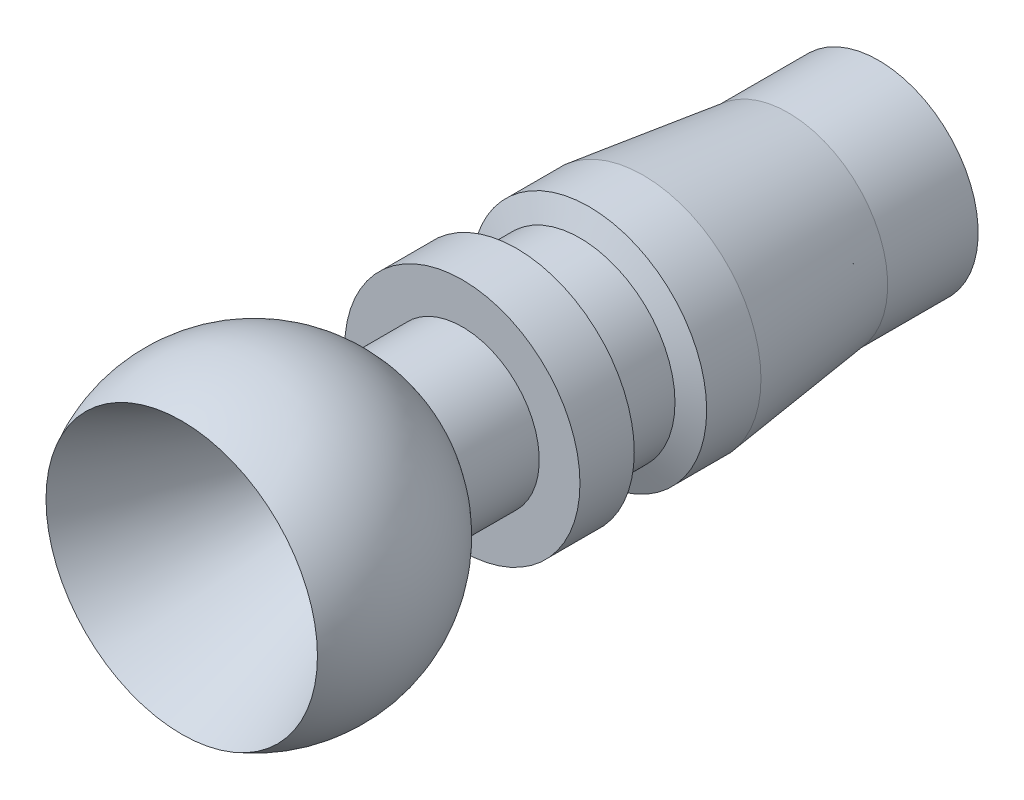
ISO-10303-21;
HEADER;
FILE_DESCRIPTION(('STEP AP214'),'2;1');
FILE_NAME('part.step','',(''),(''),'','','');
FILE_SCHEMA(('AUTOMOTIVE_DESIGN { 1 0 10303 214 1 1 1 1 }'));
ENDSEC;
DATA;
#1=APPLICATION_CONTEXT('core data for automotive mechanical design processes');
#2=APPLICATION_PROTOCOL_DEFINITION('international standard','automotive_design',2000,#1);
#3=PRODUCT_CONTEXT('',#1,'mechanical');
#4=PRODUCT('Part','Part','',(#3));
#5=PRODUCT_RELATED_PRODUCT_CATEGORY('part','',(#4));
#6=PRODUCT_DEFINITION_FORMATION('','',#4);
#7=PRODUCT_DEFINITION_CONTEXT('part definition',#1,'design');
#8=PRODUCT_DEFINITION('design','',#6,#7);
#9=PRODUCT_DEFINITION_SHAPE('','',#8);
#10=(LENGTH_UNIT() NAMED_UNIT(*) SI_UNIT(.MILLI.,.METRE.));
#11=(NAMED_UNIT(*) PLANE_ANGLE_UNIT() SI_UNIT($,.RADIAN.));
#12=(NAMED_UNIT(*) SI_UNIT($,.STERADIAN.) SOLID_ANGLE_UNIT());
#13=UNCERTAINTY_MEASURE_WITH_UNIT(LENGTH_MEASURE(1.E-05),#10,'distance_accuracy_value','');
#14=(GEOMETRIC_REPRESENTATION_CONTEXT(3) GLOBAL_UNCERTAINTY_ASSIGNED_CONTEXT((#13)) GLOBAL_UNIT_ASSIGNED_CONTEXT((#10,
#11,#12)) REPRESENTATION_CONTEXT('',''));
#15=CARTESIAN_POINT('',(0.,0.,0.));
#16=DIRECTION('',(0.,0.,1.));
#17=DIRECTION('',(1.,0.,0.));
#18=AXIS2_PLACEMENT_3D('',#15,#16,#17);
#19=CARTESIAN_POINT('',(0.,0.,-88.99));
#20=DIRECTION('',(0.,0.,-1.));
#21=DIRECTION('',(-1.,0.,0.));
#22=AXIS2_PLACEMENT_3D('',#19,#20,#21);
#23=CYLINDRICAL_SURFACE('',#22,5.5);
#24=CARTESIAN_POINT('',(0.,0.,0.));
#25=DIRECTION('',(0.,0.,-1.));
#26=DIRECTION('',(-1.,0.,0.));
#27=AXIS2_PLACEMENT_3D('',#24,#25,#26);
#28=CIRCLE('',#27,5.5);
#29=CARTESIAN_POINT('',(-5.5,0.,0.));
#30=VERTEX_POINT('',#29);
#31=EDGE_CURVE('E10',#30,#30,#28,.T.);
#32=ORIENTED_EDGE('',*,*,#31,.F.);
#33=EDGE_LOOP('',(#32));
#34=FACE_BOUND('',#33,.T.);
#35=CARTESIAN_POINT('',(0.,0.,5.));
#36=DIRECTION('',(0.,0.,-1.));
#37=DIRECTION('',(-1.,0.,0.));
#38=AXIS2_PLACEMENT_3D('',#35,#36,#37);
#39=CIRCLE('',#38,5.5);
#40=CARTESIAN_POINT('',(-5.5,0.,5.));
#41=VERTEX_POINT('',#40);
#42=EDGE_CURVE('E75',#41,#41,#39,.T.);
#43=ORIENTED_EDGE('',*,*,#42,.T.);
#44=EDGE_LOOP('',(#43));
#45=FACE_BOUND('',#44,.T.);
#46=ADVANCED_FACE('F32',(#34,#45),#23,.T.);
#47=CARTESIAN_POINT('',(2.5,0.,0.));
#48=DIRECTION('',(0.,0.,1.));
#49=DIRECTION('',(1.,0.,0.));
#50=AXIS2_PLACEMENT_3D('',#47,#48,#49);
#51=PLANE('',#50);
#52=CARTESIAN_POINT('',(0.,0.,0.));
#53=DIRECTION('',(0.,0.,-1.));
#54=DIRECTION('',(-1.,0.,0.));
#55=AXIS2_PLACEMENT_3D('',#52,#53,#54);
#56=CIRCLE('',#55,2.5);
#57=CARTESIAN_POINT('',(-2.5,0.,0.));
#58=VERTEX_POINT('',#57);
#59=EDGE_CURVE('E38',#58,#58,#56,.T.);
#60=ORIENTED_EDGE('',*,*,#59,.F.);
#61=EDGE_LOOP('',(#60));
#62=FACE_BOUND('',#61,.T.);
#63=ORIENTED_EDGE('',*,*,#31,.T.);
#64=EDGE_LOOP('',(#63));
#65=FACE_BOUND('',#64,.T.);
#66=ADVANCED_FACE('F142',(#62,#65),#51,.F.);
#67=CARTESIAN_POINT('',(0.,0.,-88.99));
#68=DIRECTION('',(0.,0.,-1.));
#69=DIRECTION('',(-1.,0.,0.));
#70=AXIS2_PLACEMENT_3D('',#67,#68,#69);
#71=CYLINDRICAL_SURFACE('',#70,2.5);
#72=CARTESIAN_POINT('',(0.,0.,27.1387840678323));
#73=DIRECTION('',(0.,0.,-1.));
#74=DIRECTION('',(-1.,0.,0.));
#75=AXIS2_PLACEMENT_3D('',#72,#73,#74);
#76=CIRCLE('',#75,2.5);
#77=CARTESIAN_POINT('',(-2.5,0.,27.1387840678323));
#78=VERTEX_POINT('',#77);
#79=EDGE_CURVE('E42',#78,#78,#76,.T.);
#80=ORIENTED_EDGE('',*,*,#79,.F.);
#81=EDGE_LOOP('',(#80));
#82=FACE_BOUND('',#81,.T.);
#83=ORIENTED_EDGE('',*,*,#59,.T.);
#84=EDGE_LOOP('',(#83));
#85=FACE_BOUND('',#84,.T.);
#86=ADVANCED_FACE('F137',(#82,#85),#71,.F.);
#87=CARTESIAN_POINT('',(0.,0.,27.1387840678323));
#88=DIRECTION('',(0.,0.,1.));
#89=DIRECTION('',(1.,0.,0.));
#90=AXIS2_PLACEMENT_3D('',#87,#88,#89);
#91=CONICAL_SURFACE('',#90,2.5,0.414396342964519);
#92=CARTESIAN_POINT('',(0.,0.,38.5026337962479));
#93=DIRECTION('',(0.,0.,-1.));
#94=DIRECTION('',(-1.,0.,0.));
#95=AXIS2_PLACEMENT_3D('',#92,#93,#94);
#96=CIRCLE('',#95,7.49859471455378);
#97=CARTESIAN_POINT('',(7.49859471455378,0.,38.5026337962479));
#98=VERTEX_POINT('',#97);
#99=EDGE_CURVE('E46',#98,#98,#96,.T.);
#100=ORIENTED_EDGE('',*,*,#99,.F.);
#101=EDGE_LOOP('',(#100));
#102=FACE_BOUND('',#101,.T.);
#103=ORIENTED_EDGE('',*,*,#79,.T.);
#104=EDGE_LOOP('',(#103));
#105=FACE_BOUND('',#104,.T.);
#106=ADVANCED_FACE('F131',(#102,#105),#91,.F.);
#107=CARTESIAN_POINT('',(0.,0.,34.5));
#108=DIRECTION('',(0.,0.,-1.));
#109=DIRECTION('',(1.,0.,0.));
#110=AXIS2_PLACEMENT_3D('',#107,#108,#109);
#111=SPHERICAL_SURFACE('',#110,8.5);
#112=CARTESIAN_POINT('',(0.,0.,27.1387840678323));
#113=DIRECTION('',(0.,0.,-1.));
#114=DIRECTION('',(-1.,0.,0.));
#115=AXIS2_PLACEMENT_3D('',#112,#113,#114);
#116=CIRCLE('',#115,4.25);
#117=CARTESIAN_POINT('',(4.25,0.,27.1387840678323));
#118=VERTEX_POINT('',#117);
#119=EDGE_CURVE('E51',#118,#118,#116,.T.);
#120=CARTESIAN_POINT('',(4.25,0.,27.1387840678323));
#121=CARTESIAN_POINT('',(4.36789640371292,0.,27.2068484611746));
#122=CARTESIAN_POINT('',(4.48415475019592,0.,27.277749601777));
#123=CARTESIAN_POINT('',(4.71313343587116,0.,27.4250517207746));
#124=CARTESIAN_POINT('',(4.82585377506341,0.,27.5014526991699));
#125=CARTESIAN_POINT('',(5.04749455332625,0.,27.6595808370263));
#126=CARTESIAN_POINT('',(5.15641499239685,0.,27.7413079964874));
#127=CARTESIAN_POINT('',(5.37020503611598,0.,27.909899145156));
#128=CARTESIAN_POINT('',(5.47507464076451,0.,27.9967631343636));
#129=CARTESIAN_POINT('',(5.68052084468261,0.,28.1754276464021));
#130=CARTESIAN_POINT('',(5.78109744395219,0.,28.267228169233));
#131=CARTESIAN_POINT('',(5.97772553183626,0.,28.4555538142915));
#132=CARTESIAN_POINT('',(6.07377702045075,0.,28.5520789365191));
#133=CARTESIAN_POINT('',(6.26113318395579,0.,28.7496310068432));
#134=CARTESIAN_POINT('',(6.35243785884633,0.,28.8506579549396));
#135=CARTESIAN_POINT('',(6.53008965912226,0.,29.056980495382));
#136=CARTESIAN_POINT('',(6.61643678450766,0.,29.1622760877281));
#137=CARTESIAN_POINT('',(6.78397418937292,0.,29.3768928873915));
#138=CARTESIAN_POINT('',(6.86516446885279,0.,29.4862140947089));
#139=CARTESIAN_POINT('',(7.02220078871068,0.,29.7086298023512));
#140=CARTESIAN_POINT('',(7.09804682908871,0.,29.8217243026761));
#141=CARTESIAN_POINT('',(7.24421961224176,0.,30.0514255656582));
#142=CARTESIAN_POINT('',(7.31454635501678,0.,30.1680323283155));
#143=CARTESIAN_POINT('',(7.44951822348128,0.,30.404488978627));
#144=CARTESIAN_POINT('',(7.51416334917077,0.,30.5243388662813));
#145=CARTESIAN_POINT('',(7.63762277757235,0.,30.7670051438956));
#146=CARTESIAN_POINT('',(7.69643708028446,0.,30.8898215338557));
#147=CARTESIAN_POINT('',(7.8080991148285,0.,31.1381373464698));
#148=CARTESIAN_POINT('',(7.86094684666043,0.,31.2636367691238));
#149=CARTESIAN_POINT('',(7.96055376284161,0.,31.5170289848715));
#150=CARTESIAN_POINT('',(8.00731294719086,0.,31.6449217779651));
#151=CARTESIAN_POINT('',(8.09463484463717,0.,31.9028055482552));
#152=CARTESIAN_POINT('',(8.13519755773423,0.,32.0327965254517));
#153=CARTESIAN_POINT('',(8.21003289083559,0.,32.2945766348417));
#154=CARTESIAN_POINT('',(8.24430551083988,0.,32.4263657670353));
#155=CARTESIAN_POINT('',(8.30648155393059,0.,32.6914380070346));
#156=CARTESIAN_POINT('',(8.334384977017,0.,32.8247211148403));
#157=CARTESIAN_POINT('',(8.38375822303969,0.,33.0924736784691));
#158=CARTESIAN_POINT('',(8.40522804597598,0.,33.2269431342923));
#159=CARTESIAN_POINT('',(8.44168453770734,0.,33.4967580281794));
#160=CARTESIAN_POINT('',(8.45667120650242,0.,33.6321034662435));
#161=CARTESIAN_POINT('',(8.48012679957343,0.,33.9033579370014));
#162=CARTESIAN_POINT('',(8.48859572384936,0.,34.0392669696952));
#163=CARTESIAN_POINT('',(8.49899628096338,0.,34.3113349412851));
#164=CARTESIAN_POINT('',(8.50092791380147,0.,34.4474938801813));
#165=CARTESIAN_POINT('',(8.49824942966313,0.,34.7197473989336));
#166=CARTESIAN_POINT('',(8.49363931268669,0.,34.8558419787898));
#167=CARTESIAN_POINT('',(8.47788796949807,0.,35.1276526628114));
#168=CARTESIAN_POINT('',(8.46674674328588,0.,35.2633687669768));
#169=CARTESIAN_POINT('',(8.43795889614108,0.,35.5341092563454));
#170=CARTESIAN_POINT('',(8.42031227520847,0.,35.6691336415485));
#171=CARTESIAN_POINT('',(8.37855436943893,0.,35.9381790469016));
#172=CARTESIAN_POINT('',(8.354443084602,0.,36.0722000670517));
#173=CARTESIAN_POINT('',(8.2998114977294,0.,36.3389294096603));
#174=CARTESIAN_POINT('',(8.26929119569373,0.,36.4716377321189));
#175=CARTESIAN_POINT('',(8.20191203247247,0.,36.7354353854353));
#176=CARTESIAN_POINT('',(8.16505317128689,0.,36.8665247162932));
#177=CARTESIAN_POINT('',(8.08508190737422,0.,37.1267817959558));
#178=CARTESIAN_POINT('',(8.04196950464715,0.,37.2559495447606));
#179=CARTESIAN_POINT('',(7.94959087134614,0.,37.5120654292978));
#180=CARTESIAN_POINT('',(7.90032464077219,0.,37.6390135650302));
#181=CARTESIAN_POINT('',(7.79575128955768,0.,37.8903968516398));
#182=CARTESIAN_POINT('',(7.7404441689171,0.,38.014832002517));
#183=CARTESIAN_POINT('',(7.62391957342737,0.,38.26090347872));
#184=CARTESIAN_POINT('',(7.56270209857821,0.,38.3825398040458));
#185=CARTESIAN_POINT('',(7.49859471455378,0.,38.5026337962479));
#186=B_SPLINE_CURVE_WITH_KNOTS('',3,(#120,#121,#122,#123,#124,#125,#126,#127,#128,#129,#130,
#131,#132,#133,#134,#135,#136,#137,#138,#139,#140,#141,#142,#143,#144,#145,#146,#147,#148,#149,
#150,#151,#152,#153,#154,#155,#156,#157,#158,#159,#160,#161,#162,#163,#164,#165,#166,#167,#168,
#169,#170,#171,#172,#173,#174,#175,#176,#177,#178,#179,#180,#181,#182,#183,#184,#185),
.UNSPECIFIED.,.F.,.F.,(4,2,2,2,2,2,2,2,2,2,2,2,2,2,2,2,2,2,2,2,2,2,2,2,2,2,2,2,2,2,2,2,4),(0.,
0.408360771150604,0.816721542301209,1.22508231345181,1.63344308460242,2.04180385575302,
2.45016462690363,2.85852539805423,3.26688616920483,3.67524694035544,4.08360771150604,
4.49196848265665,4.90032925380725,5.30869002495786,5.71705079610846,6.12541156725907,
6.53377233840967,6.94213310956028,7.35049388071088,7.75885465186148,8.16721542301209,
8.57557619416269,8.98393696531329,9.3922977364639,9.8006585076145,10.2090192787651,
10.6173800499157,11.0257408210663,11.4341015922169,11.8424623633675,12.2508231345181,
12.6591839056687,13.0675446768193),.UNSPECIFIED.);
#187=EDGE_CURVE('BSEAM125',#118,#98,#186,.T.);
#188=ORIENTED_EDGE('',*,*,#119,.F.);
#189=ORIENTED_EDGE('',*,*,#99,.T.);
#190=ORIENTED_EDGE('',*,*,#187,.T.);
#191=ORIENTED_EDGE('',*,*,#187,.F.);
#192=EDGE_LOOP('',(#188,#190,#189,#191));
#193=FACE_BOUND('',#192,.T.);
#194=ADVANCED_FACE('F125',(#193),#111,.T.);
#195=CARTESIAN_POINT('',(0.,0.,-88.99));
#196=DIRECTION('',(0.,0.,-1.));
#197=DIRECTION('',(-1.,0.,0.));
#198=AXIS2_PLACEMENT_3D('',#195,#196,#197);
#199=CYLINDRICAL_SURFACE('',#198,4.25);
#200=CARTESIAN_POINT('',(0.,0.,23.));
#201=DIRECTION('',(0.,0.,-1.));
#202=DIRECTION('',(-1.,0.,0.));
#203=AXIS2_PLACEMENT_3D('',#200,#201,#202);
#204=CIRCLE('',#203,4.25);
#205=CARTESIAN_POINT('',(-4.25,0.,23.));
#206=VERTEX_POINT('',#205);
#207=EDGE_CURVE('E54',#206,#206,#204,.T.);
#208=ORIENTED_EDGE('',*,*,#207,.F.);
#209=EDGE_LOOP('',(#208));
#210=FACE_BOUND('',#209,.T.);
#211=ORIENTED_EDGE('',*,*,#119,.T.);
#212=EDGE_LOOP('',(#211));
#213=FACE_BOUND('',#212,.T.);
#214=ADVANCED_FACE('F119',(#210,#213),#199,.T.);
#215=CARTESIAN_POINT('',(6.5,0.,23.));
#216=DIRECTION('',(0.,0.,-1.));
#217=DIRECTION('',(-1.,0.,0.));
#218=AXIS2_PLACEMENT_3D('',#215,#216,#217);
#219=PLANE('',#218);
#220=CARTESIAN_POINT('',(0.,0.,23.));
#221=DIRECTION('',(0.,0.,-1.));
#222=DIRECTION('',(-1.,0.,0.));
#223=AXIS2_PLACEMENT_3D('',#220,#221,#222);
#224=CIRCLE('',#223,6.5);
#225=CARTESIAN_POINT('',(-6.5,0.,23.));
#226=VERTEX_POINT('',#225);
#227=EDGE_CURVE('E57',#226,#226,#224,.T.);
#228=ORIENTED_EDGE('',*,*,#227,.F.);
#229=EDGE_LOOP('',(#228));
#230=FACE_BOUND('',#229,.T.);
#231=ORIENTED_EDGE('',*,*,#207,.T.);
#232=EDGE_LOOP('',(#231));
#233=FACE_BOUND('',#232,.T.);
#234=ADVANCED_FACE('F113',(#230,#233),#219,.F.);
#235=CARTESIAN_POINT('',(0.,0.,-88.99));
#236=DIRECTION('',(0.,0.,-1.));
#237=DIRECTION('',(-1.,0.,0.));
#238=AXIS2_PLACEMENT_3D('',#235,#236,#237);
#239=CYLINDRICAL_SURFACE('',#238,6.5);
#240=CARTESIAN_POINT('',(0.,0.,20.));
#241=DIRECTION('',(0.,0.,-1.));
#242=DIRECTION('',(-1.,0.,0.));
#243=AXIS2_PLACEMENT_3D('',#240,#241,#242);
#244=CIRCLE('',#243,6.5);
#245=CARTESIAN_POINT('',(-6.5,0.,20.));
#246=VERTEX_POINT('',#245);
#247=EDGE_CURVE('E60',#246,#246,#244,.T.);
#248=ORIENTED_EDGE('',*,*,#247,.F.);
#249=EDGE_LOOP('',(#248));
#250=FACE_BOUND('',#249,.T.);
#251=ORIENTED_EDGE('',*,*,#227,.T.);
#252=EDGE_LOOP('',(#251));
#253=FACE_BOUND('',#252,.T.);
#254=ADVANCED_FACE('F107',(#250,#253),#239,.T.);
#255=CARTESIAN_POINT('',(5.25,0.,20.));
#256=DIRECTION('',(0.,0.,1.));
#257=DIRECTION('',(1.,0.,0.));
#258=AXIS2_PLACEMENT_3D('',#255,#256,#257);
#259=PLANE('',#258);
#260=CARTESIAN_POINT('',(0.,0.,20.));
#261=DIRECTION('',(0.,0.,-1.));
#262=DIRECTION('',(-1.,0.,0.));
#263=AXIS2_PLACEMENT_3D('',#260,#261,#262);
#264=CIRCLE('',#263,5.25);
#265=CARTESIAN_POINT('',(-5.25,0.,20.));
#266=VERTEX_POINT('',#265);
#267=EDGE_CURVE('E63',#266,#266,#264,.T.);
#268=ORIENTED_EDGE('',*,*,#267,.F.);
#269=EDGE_LOOP('',(#268));
#270=FACE_BOUND('',#269,.T.);
#271=ORIENTED_EDGE('',*,*,#247,.T.);
#272=EDGE_LOOP('',(#271));
#273=FACE_BOUND('',#272,.T.);
#274=ADVANCED_FACE('F101',(#270,#273),#259,.F.);
#275=CARTESIAN_POINT('',(0.,0.,-88.99));
#276=DIRECTION('',(0.,0.,-1.));
#277=DIRECTION('',(-1.,0.,0.));
#278=AXIS2_PLACEMENT_3D('',#275,#276,#277);
#279=CYLINDRICAL_SURFACE('',#278,5.25);
#280=CARTESIAN_POINT('',(0.,0.,16.5));
#281=DIRECTION('',(0.,0.,-1.));
#282=DIRECTION('',(-1.,0.,0.));
#283=AXIS2_PLACEMENT_3D('',#280,#281,#282);
#284=CIRCLE('',#283,5.25);
#285=CARTESIAN_POINT('',(-5.25,0.,16.5));
#286=VERTEX_POINT('',#285);
#287=EDGE_CURVE('E66',#286,#286,#284,.T.);
#288=ORIENTED_EDGE('',*,*,#287,.F.);
#289=EDGE_LOOP('',(#288));
#290=FACE_BOUND('',#289,.T.);
#291=ORIENTED_EDGE('',*,*,#267,.T.);
#292=EDGE_LOOP('',(#291));
#293=FACE_BOUND('',#292,.T.);
#294=ADVANCED_FACE('F95',(#290,#293),#279,.T.);
#295=CARTESIAN_POINT('',(0.,0.,16.5));
#296=DIRECTION('',(0.,0.,-1.));
#297=DIRECTION('',(-1.,0.,0.));
#298=AXIS2_PLACEMENT_3D('',#295,#296,#297);
#299=CONICAL_SURFACE('',#298,5.25,1.19028994968253);
#300=CARTESIAN_POINT('',(0.,0.,16.));
#301=DIRECTION('',(0.,0.,-1.));
#302=DIRECTION('',(-1.,0.,0.));
#303=AXIS2_PLACEMENT_3D('',#300,#301,#302);
#304=CIRCLE('',#303,6.5);
#305=CARTESIAN_POINT('',(-6.5,0.,16.));
#306=VERTEX_POINT('',#305);
#307=EDGE_CURVE('E69',#306,#306,#304,.T.);
#308=ORIENTED_EDGE('',*,*,#307,.F.);
#309=EDGE_LOOP('',(#308));
#310=FACE_BOUND('',#309,.T.);
#311=ORIENTED_EDGE('',*,*,#287,.T.);
#312=EDGE_LOOP('',(#311));
#313=FACE_BOUND('',#312,.T.);
#314=ADVANCED_FACE('F89',(#310,#313),#299,.T.);
#315=CARTESIAN_POINT('',(0.,0.,-88.99));
#316=DIRECTION('',(0.,0.,-1.));
#317=DIRECTION('',(-1.,0.,0.));
#318=AXIS2_PLACEMENT_3D('',#315,#316,#317);
#319=CYLINDRICAL_SURFACE('',#318,6.5);
#320=CARTESIAN_POINT('',(0.,0.,13.));
#321=DIRECTION('',(0.,0.,-1.));
#322=DIRECTION('',(-1.,0.,0.));
#323=AXIS2_PLACEMENT_3D('',#320,#321,#322);
#324=CIRCLE('',#323,6.5);
#325=CARTESIAN_POINT('',(-6.5,0.,13.));
#326=VERTEX_POINT('',#325);
#327=EDGE_CURVE('E72',#326,#326,#324,.T.);
#328=ORIENTED_EDGE('',*,*,#327,.F.);
#329=EDGE_LOOP('',(#328));
#330=FACE_BOUND('',#329,.T.);
#331=ORIENTED_EDGE('',*,*,#307,.T.);
#332=EDGE_LOOP('',(#331));
#333=FACE_BOUND('',#332,.T.);
#334=ADVANCED_FACE('F83',(#330,#333),#319,.T.);
#335=CARTESIAN_POINT('',(0.,0.,13.));
#336=DIRECTION('',(0.,0.,1.));
#337=DIRECTION('',(1.,0.,0.));
#338=AXIS2_PLACEMENT_3D('',#335,#336,#337);
#339=CONICAL_SURFACE('',#338,6.5,0.124354994546762);
#340=ORIENTED_EDGE('',*,*,#42,.F.);
#341=EDGE_LOOP('',(#340));
#342=FACE_BOUND('',#341,.T.);
#343=ORIENTED_EDGE('',*,*,#327,.T.);
#344=EDGE_LOOP('',(#343));
#345=FACE_BOUND('',#344,.T.);
#346=ADVANCED_FACE('F80',(#342,#345),#339,.T.);
#347=CLOSED_SHELL('',(#46,#66,#86,#106,#194,#214,#234,#254,#274,#294,#314,#334,#346));
#348=MANIFOLD_SOLID_BREP('B2',#347);
#349=ADVANCED_BREP_SHAPE_REPRESENTATION('',(#18,#348),#14);
#350=SHAPE_DEFINITION_REPRESENTATION(#9,#349);
ENDSEC;
END-ISO-10303-21;
